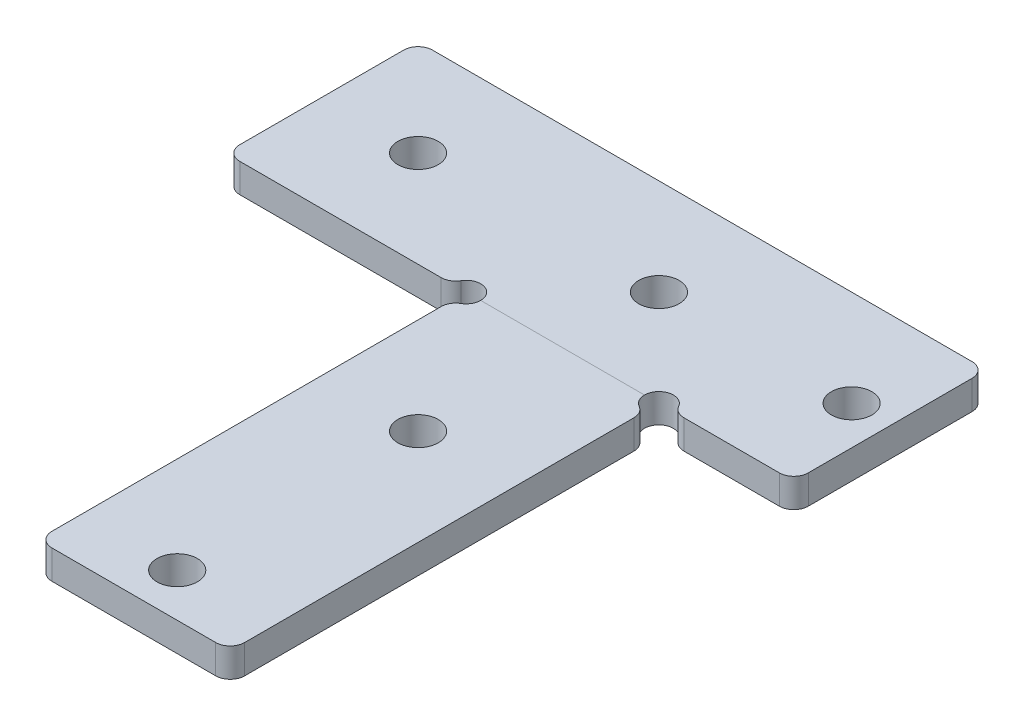
ISO-10303-21;
HEADER;
FILE_DESCRIPTION(('STEP AP214'),'2;1');
FILE_NAME('part.step','',(''),(''),'','','');
FILE_SCHEMA(('AUTOMOTIVE_DESIGN { 1 0 10303 214 1 1 1 1 }'));
ENDSEC;
DATA;
#1=APPLICATION_CONTEXT('core data for automotive mechanical design processes');
#2=APPLICATION_PROTOCOL_DEFINITION('international standard','automotive_design',2000,#1);
#3=PRODUCT_CONTEXT('',#1,'mechanical');
#4=PRODUCT('Part','Part','',(#3));
#5=PRODUCT_RELATED_PRODUCT_CATEGORY('part','',(#4));
#6=PRODUCT_DEFINITION_FORMATION('','',#4);
#7=PRODUCT_DEFINITION_CONTEXT('part definition',#1,'design');
#8=PRODUCT_DEFINITION('design','',#6,#7);
#9=PRODUCT_DEFINITION_SHAPE('','',#8);
#10=(LENGTH_UNIT() NAMED_UNIT(*) SI_UNIT(.MILLI.,.METRE.));
#11=(NAMED_UNIT(*) PLANE_ANGLE_UNIT() SI_UNIT($,.RADIAN.));
#12=(NAMED_UNIT(*) SI_UNIT($,.STERADIAN.) SOLID_ANGLE_UNIT());
#13=UNCERTAINTY_MEASURE_WITH_UNIT(LENGTH_MEASURE(1.E-05),#10,'distance_accuracy_value','');
#14=(GEOMETRIC_REPRESENTATION_CONTEXT(3) GLOBAL_UNCERTAINTY_ASSIGNED_CONTEXT((#13)) GLOBAL_UNIT_ASSIGNED_CONTEXT((#10,
#11,#12)) REPRESENTATION_CONTEXT('',''));
#15=CARTESIAN_POINT('',(0.,0.,0.));
#16=DIRECTION('',(0.,0.,1.));
#17=DIRECTION('',(1.,0.,0.));
#18=AXIS2_PLACEMENT_3D('',#15,#16,#17);
#19=CARTESIAN_POINT('',(0.,3.,0.));
#20=DIRECTION('',(0.,-1.,0.));
#21=DIRECTION('',(0.,0.,-1.));
#22=AXIS2_PLACEMENT_3D('',#19,#20,#21);
#23=PLANE('',#22);
#24=CARTESIAN_POINT('',(-25.,3.,0.));
#25=DIRECTION('',(0.,1.,0.));
#26=DIRECTION('',(0.,0.,1.));
#27=AXIS2_PLACEMENT_3D('',#24,#25,#26);
#28=CIRCLE('',#27,2.1);
#29=CARTESIAN_POINT('',(-25.,3.,2.1));
#30=VERTEX_POINT('',#29);
#31=EDGE_CURVE('E231',#30,#30,#28,.T.);
#32=ORIENTED_EDGE('',*,*,#31,.F.);
#33=EDGE_LOOP('',(#32));
#34=FACE_BOUND('',#33,.T.);
#35=CARTESIAN_POINT('',(20.,3.,0.));
#36=DIRECTION('',(0.,1.,0.));
#37=DIRECTION('',(0.,0.,1.));
#38=AXIS2_PLACEMENT_3D('',#35,#36,#37);
#39=CIRCLE('',#38,2.1);
#40=CARTESIAN_POINT('',(20.,3.,2.1));
#41=VERTEX_POINT('',#40);
#42=EDGE_CURVE('E237',#41,#41,#39,.T.);
#43=ORIENTED_EDGE('',*,*,#42,.F.);
#44=EDGE_LOOP('',(#43));
#45=FACE_BOUND('',#44,.T.);
#46=CARTESIAN_POINT('',(0.,3.,0.));
#47=DIRECTION('',(0.,1.,0.));
#48=DIRECTION('',(0.,0.,1.));
#49=AXIS2_PLACEMENT_3D('',#46,#47,#48);
#50=CIRCLE('',#49,2.1);
#51=CARTESIAN_POINT('',(0.,3.,2.1));
#52=VERTEX_POINT('',#51);
#53=EDGE_CURVE('E243',#52,#52,#50,.T.);
#54=ORIENTED_EDGE('',*,*,#53,.F.);
#55=EDGE_LOOP('',(#54));
#56=FACE_BOUND('',#55,.T.);
#57=DIRECTION('',(-1.,0.,0.));
#58=VECTOR('',#57,1.);
#59=CARTESIAN_POINT('',(0.,3.,10.));
#60=LINE('',#59,#58);
#61=CARTESIAN_POINT('',(8.5,3.,10.));
#62=VERTEX_POINT('',#61);
#63=CARTESIAN_POINT('',(-8.5,3.,10.));
#64=VERTEX_POINT('',#63);
#65=EDGE_CURVE('E11',#62,#64,#60,.T.);
#66=ORIENTED_EDGE('',*,*,#65,.F.);
#67=CARTESIAN_POINT('',(10.,3.,10.));
#68=DIRECTION('',(0.,1.,0.));
#69=DIRECTION('',(0.,0.,1.));
#70=AXIS2_PLACEMENT_3D('',#67,#68,#69);
#71=CIRCLE('',#70,1.5);
#72=CARTESIAN_POINT('',(11.2990381056767,3.,9.25));
#73=VERTEX_POINT('',#72);
#74=EDGE_CURVE('E215',#73,#62,#71,.T.);
#75=ORIENTED_EDGE('',*,*,#74,.F.);
#76=CARTESIAN_POINT('',(12.5980762113533,3.,8.5));
#77=DIRECTION('',(0.,-1.,0.));
#78=DIRECTION('',(0.,0.,-1.));
#79=AXIS2_PLACEMENT_3D('',#76,#77,#78);
#80=CIRCLE('',#79,1.5);
#81=CARTESIAN_POINT('',(12.5980762113533,3.,10.));
#82=VERTEX_POINT('',#81);
#83=EDGE_CURVE('E293',#73,#82,#80,.F.);
#84=ORIENTED_EDGE('',*,*,#83,.T.);
#85=DIRECTION('',(1.,0.,0.));
#86=VECTOR('',#85,1.);
#87=CARTESIAN_POINT('',(24.,3.,10.));
#88=LINE('',#87,#86);
#89=CARTESIAN_POINT('',(22.5,3.,10.));
#90=VERTEX_POINT('',#89);
#91=EDGE_CURVE('E257',#82,#90,#88,.T.);
#92=ORIENTED_EDGE('',*,*,#91,.T.);
#93=CARTESIAN_POINT('',(22.5,3.,8.5));
#94=DIRECTION('',(0.,-1.,0.));
#95=DIRECTION('',(0.,0.,-1.));
#96=AXIS2_PLACEMENT_3D('',#93,#94,#95);
#97=CIRCLE('',#96,1.5);
#98=CARTESIAN_POINT('',(24.,3.,8.5));
#99=VERTEX_POINT('',#98);
#100=EDGE_CURVE('E295',#90,#99,#97,.F.);
#101=ORIENTED_EDGE('',*,*,#100,.T.);
#102=DIRECTION('',(0.,0.,-1.));
#103=VECTOR('',#102,1.);
#104=CARTESIAN_POINT('',(24.,3.,-10.));
#105=LINE('',#104,#103);
#106=CARTESIAN_POINT('',(24.,3.,-8.5));
#107=VERTEX_POINT('',#106);
#108=EDGE_CURVE('E260',#99,#107,#105,.T.);
#109=ORIENTED_EDGE('',*,*,#108,.T.);
#110=CARTESIAN_POINT('',(22.5,3.,-8.5));
#111=DIRECTION('',(0.,-1.,0.));
#112=DIRECTION('',(0.,0.,-1.));
#113=AXIS2_PLACEMENT_3D('',#110,#111,#112);
#114=CIRCLE('',#113,1.5);
#115=CARTESIAN_POINT('',(22.5,3.,-10.));
#116=VERTEX_POINT('',#115);
#117=EDGE_CURVE('E204',#107,#116,#114,.F.);
#118=ORIENTED_EDGE('',*,*,#117,.T.);
#119=DIRECTION('',(-1.,0.,0.));
#120=VECTOR('',#119,1.);
#121=CARTESIAN_POINT('',(-35.,3.,-10.));
#122=LINE('',#121,#120);
#123=CARTESIAN_POINT('',(-33.5,3.,-10.));
#124=VERTEX_POINT('',#123);
#125=EDGE_CURVE('E263',#116,#124,#122,.T.);
#126=ORIENTED_EDGE('',*,*,#125,.T.);
#127=CARTESIAN_POINT('',(-33.5,3.,-8.5));
#128=DIRECTION('',(0.,-1.,0.));
#129=DIRECTION('',(0.,0.,-1.));
#130=AXIS2_PLACEMENT_3D('',#127,#128,#129);
#131=CIRCLE('',#130,1.5);
#132=CARTESIAN_POINT('',(-35.,3.,-8.5));
#133=VERTEX_POINT('',#132);
#134=EDGE_CURVE('E297',#124,#133,#131,.F.);
#135=ORIENTED_EDGE('',*,*,#134,.T.);
#136=DIRECTION('',(0.,0.,1.));
#137=VECTOR('',#136,1.);
#138=CARTESIAN_POINT('',(-35.,3.,10.));
#139=LINE('',#138,#137);
#140=CARTESIAN_POINT('',(-35.,3.,8.5));
#141=VERTEX_POINT('',#140);
#142=EDGE_CURVE('E266',#133,#141,#139,.T.);
#143=ORIENTED_EDGE('',*,*,#142,.T.);
#144=CARTESIAN_POINT('',(-33.5,3.,8.5));
#145=DIRECTION('',(0.,-1.,0.));
#146=DIRECTION('',(0.,0.,-1.));
#147=AXIS2_PLACEMENT_3D('',#144,#145,#146);
#148=CIRCLE('',#147,1.5);
#149=CARTESIAN_POINT('',(-33.5,3.,10.));
#150=VERTEX_POINT('',#149);
#151=EDGE_CURVE('E299',#141,#150,#148,.F.);
#152=ORIENTED_EDGE('',*,*,#151,.T.);
#153=DIRECTION('',(1.,0.,0.));
#154=VECTOR('',#153,1.);
#155=CARTESIAN_POINT('',(-10.,3.,10.));
#156=LINE('',#155,#154);
#157=CARTESIAN_POINT('',(-12.5980762113533,3.,10.));
#158=VERTEX_POINT('',#157);
#159=EDGE_CURVE('E249',#150,#158,#156,.T.);
#160=ORIENTED_EDGE('',*,*,#159,.T.);
#161=CARTESIAN_POINT('',(-12.5980762113533,3.,8.5));
#162=DIRECTION('',(0.,-1.,0.));
#163=DIRECTION('',(0.,0.,-1.));
#164=AXIS2_PLACEMENT_3D('',#161,#162,#163);
#165=CIRCLE('',#164,1.5);
#166=CARTESIAN_POINT('',(-11.2990381056767,3.,9.25));
#167=VERTEX_POINT('',#166);
#168=EDGE_CURVE('E301',#158,#167,#165,.F.);
#169=ORIENTED_EDGE('',*,*,#168,.T.);
#170=CARTESIAN_POINT('',(-10.,3.,10.));
#171=DIRECTION('',(0.,1.,0.));
#172=DIRECTION('',(0.,0.,1.));
#173=AXIS2_PLACEMENT_3D('',#170,#171,#172);
#174=CIRCLE('',#173,1.5);
#175=EDGE_CURVE('E429',#64,#167,#174,.T.);
#176=ORIENTED_EDGE('',*,*,#175,.F.);
#177=EDGE_LOOP('',(#66,#75,#84,#92,#101,#109,#118,#126,#135,#143,#152,#160,#169,#176));
#178=FACE_BOUND('',#177,.T.);
#179=ADVANCED_FACE('F43',(#34,#45,#56,#178),#23,.F.);
#180=CARTESIAN_POINT('',(9.25,3.,11.2990381056767));
#181=VERTEX_POINT('',#180);
#182=EDGE_CURVE('E375',#62,#181,#71,.T.);
#183=ORIENTED_EDGE('',*,*,#182,.F.);
#184=ORIENTED_EDGE('',*,*,#65,.T.);
#185=CARTESIAN_POINT('',(-9.25,3.,11.2990381056767));
#186=VERTEX_POINT('',#185);
#187=EDGE_CURVE('E432',#186,#64,#174,.T.);
#188=ORIENTED_EDGE('',*,*,#187,.F.);
#189=CARTESIAN_POINT('',(-8.5,3.,12.5980762113533));
#190=DIRECTION('',(0.,-1.,0.));
#191=DIRECTION('',(0.,0.,-1.));
#192=AXIS2_PLACEMENT_3D('',#189,#190,#191);
#193=CIRCLE('',#192,1.5);
#194=CARTESIAN_POINT('',(-10.,3.,12.5980762113533));
#195=VERTEX_POINT('',#194);
#196=EDGE_CURVE('E304',#186,#195,#193,.F.);
#197=ORIENTED_EDGE('',*,*,#196,.T.);
#198=DIRECTION('',(0.,0.,1.));
#199=VECTOR('',#198,1.);
#200=CARTESIAN_POINT('',(-9.99999999999999,3.,60.));
#201=LINE('',#200,#199);
#202=CARTESIAN_POINT('',(-9.99999999999999,3.,53.));
#203=VERTEX_POINT('',#202);
#204=EDGE_CURVE('E252',#195,#203,#201,.T.);
#205=ORIENTED_EDGE('',*,*,#204,.T.);
#206=CARTESIAN_POINT('',(-8.49999999999999,3.,53.));
#207=DIRECTION('',(0.,-1.,0.));
#208=DIRECTION('',(0.,0.,-1.));
#209=AXIS2_PLACEMENT_3D('',#206,#207,#208);
#210=CIRCLE('',#209,1.5);
#211=CARTESIAN_POINT('',(-8.49999999999999,3.,54.5));
#212=VERTEX_POINT('',#211);
#213=EDGE_CURVE('E194',#203,#212,#210,.F.);
#214=ORIENTED_EDGE('',*,*,#213,.T.);
#215=DIRECTION('',(-1.,0.,0.));
#216=VECTOR('',#215,1.);
#217=CARTESIAN_POINT('',(-9.99999999999999,3.,54.5));
#218=LINE('',#217,#216);
#219=CARTESIAN_POINT('',(8.50000000000001,3.,54.5));
#220=VERTEX_POINT('',#219);
#221=EDGE_CURVE('E200',#220,#212,#218,.T.);
#222=ORIENTED_EDGE('',*,*,#221,.F.);
#223=CARTESIAN_POINT('',(8.50000000000001,3.,53.));
#224=DIRECTION('',(0.,-1.,0.));
#225=DIRECTION('',(0.,0.,-1.));
#226=AXIS2_PLACEMENT_3D('',#223,#224,#225);
#227=CIRCLE('',#226,1.5);
#228=CARTESIAN_POINT('',(10.,3.,53.));
#229=VERTEX_POINT('',#228);
#230=EDGE_CURVE('E184',#220,#229,#227,.F.);
#231=ORIENTED_EDGE('',*,*,#230,.T.);
#232=DIRECTION('',(0.,0.,-1.));
#233=VECTOR('',#232,1.);
#234=CARTESIAN_POINT('',(10.,3.,10.));
#235=LINE('',#234,#233);
#236=CARTESIAN_POINT('',(10.,3.,12.5980762113533));
#237=VERTEX_POINT('',#236);
#238=EDGE_CURVE('E255',#229,#237,#235,.T.);
#239=ORIENTED_EDGE('',*,*,#238,.T.);
#240=CARTESIAN_POINT('',(8.5,3.,12.5980762113533));
#241=DIRECTION('',(0.,-1.,0.));
#242=DIRECTION('',(0.,0.,-1.));
#243=AXIS2_PLACEMENT_3D('',#240,#241,#242);
#244=CIRCLE('',#243,1.5);
#245=EDGE_CURVE('E290',#237,#181,#244,.F.);
#246=ORIENTED_EDGE('',*,*,#245,.T.);
#247=EDGE_LOOP('',(#183,#184,#188,#197,#205,#214,#222,#231,#239,#246));
#248=FACE_BOUND('',#247,.T.);
#249=CARTESIAN_POINT('',(0.,3.,25.));
#250=DIRECTION('',(0.,1.,0.));
#251=DIRECTION('',(0.,0.,1.));
#252=AXIS2_PLACEMENT_3D('',#249,#250,#251);
#253=CIRCLE('',#252,2.1);
#254=CARTESIAN_POINT('',(0.,3.,27.1));
#255=VERTEX_POINT('',#254);
#256=EDGE_CURVE('E225',#255,#255,#253,.T.);
#257=ORIENTED_EDGE('',*,*,#256,.F.);
#258=EDGE_LOOP('',(#257));
#259=FACE_BOUND('',#258,.T.);
#260=CARTESIAN_POINT('',(0.,3.,50.));
#261=DIRECTION('',(0.,1.,0.));
#262=DIRECTION('',(0.,0.,1.));
#263=AXIS2_PLACEMENT_3D('',#260,#261,#262);
#264=CIRCLE('',#263,2.1);
#265=CARTESIAN_POINT('',(0.,3.,52.1));
#266=VERTEX_POINT('',#265);
#267=EDGE_CURVE('E219',#266,#266,#264,.T.);
#268=ORIENTED_EDGE('',*,*,#267,.F.);
#269=EDGE_LOOP('',(#268));
#270=FACE_BOUND('',#269,.T.);
#271=ADVANCED_FACE('F207',(#248,#259,#270),#23,.F.);
#272=CARTESIAN_POINT('',(0.,0.,0.));
#273=DIRECTION('',(0.,-1.,0.));
#274=DIRECTION('',(0.,0.,-1.));
#275=AXIS2_PLACEMENT_3D('',#272,#273,#274);
#276=PLANE('',#275);
#277=DIRECTION('',(0.,0.,-1.));
#278=VECTOR('',#277,1.);
#279=CARTESIAN_POINT('',(10.,0.,10.));
#280=LINE('',#279,#278);
#281=CARTESIAN_POINT('',(10.,0.,53.));
#282=VERTEX_POINT('',#281);
#283=CARTESIAN_POINT('',(10.,0.,12.5980762113533));
#284=VERTEX_POINT('',#283);
#285=EDGE_CURVE('E274',#282,#284,#280,.T.);
#286=ORIENTED_EDGE('',*,*,#285,.F.);
#287=CARTESIAN_POINT('',(8.50000000000001,0.,53.));
#288=DIRECTION('',(0.,-1.,0.));
#289=DIRECTION('',(0.,0.,-1.));
#290=AXIS2_PLACEMENT_3D('',#287,#288,#289);
#291=CIRCLE('',#290,1.5);
#292=CARTESIAN_POINT('',(8.50000000000001,0.,54.5));
#293=VERTEX_POINT('',#292);
#294=EDGE_CURVE('E328',#282,#293,#291,.T.);
#295=ORIENTED_EDGE('',*,*,#294,.T.);
#296=DIRECTION('',(-1.,0.,0.));
#297=VECTOR('',#296,1.);
#298=CARTESIAN_POINT('',(-9.99999999999999,0.,54.5));
#299=LINE('',#298,#297);
#300=CARTESIAN_POINT('',(-8.49999999999999,0.,54.5));
#301=VERTEX_POINT('',#300);
#302=EDGE_CURVE('E203',#293,#301,#299,.T.);
#303=ORIENTED_EDGE('',*,*,#302,.T.);
#304=CARTESIAN_POINT('',(-8.49999999999999,0.,53.));
#305=DIRECTION('',(0.,-1.,0.));
#306=DIRECTION('',(0.,0.,-1.));
#307=AXIS2_PLACEMENT_3D('',#304,#305,#306);
#308=CIRCLE('',#307,1.5);
#309=CARTESIAN_POINT('',(-9.99999999999999,0.,53.));
#310=VERTEX_POINT('',#309);
#311=EDGE_CURVE('E326',#301,#310,#308,.T.);
#312=ORIENTED_EDGE('',*,*,#311,.T.);
#313=DIRECTION('',(0.,0.,1.));
#314=VECTOR('',#313,1.);
#315=CARTESIAN_POINT('',(-9.99999999999999,0.,60.));
#316=LINE('',#315,#314);
#317=CARTESIAN_POINT('',(-10.,0.,12.5980762113533));
#318=VERTEX_POINT('',#317);
#319=EDGE_CURVE('E271',#318,#310,#316,.T.);
#320=ORIENTED_EDGE('',*,*,#319,.F.);
#321=CARTESIAN_POINT('',(-8.5,0.,12.5980762113533));
#322=DIRECTION('',(0.,-1.,0.));
#323=DIRECTION('',(0.,0.,-1.));
#324=AXIS2_PLACEMENT_3D('',#321,#322,#323);
#325=CIRCLE('',#324,1.5);
#326=CARTESIAN_POINT('',(-9.25,0.,11.2990381056767));
#327=VERTEX_POINT('',#326);
#328=EDGE_CURVE('E324',#318,#327,#325,.T.);
#329=ORIENTED_EDGE('',*,*,#328,.T.);
#330=CARTESIAN_POINT('',(-10.,0.,10.));
#331=DIRECTION('',(0.,1.,0.));
#332=DIRECTION('',(0.,0.,1.));
#333=AXIS2_PLACEMENT_3D('',#330,#331,#332);
#334=CIRCLE('',#333,1.5);
#335=CARTESIAN_POINT('',(-11.2990381056767,0.,9.25));
#336=VERTEX_POINT('',#335);
#337=EDGE_CURVE('E425',#327,#336,#334,.T.);
#338=ORIENTED_EDGE('',*,*,#337,.T.);
#339=CARTESIAN_POINT('',(-12.5980762113533,0.,8.5));
#340=DIRECTION('',(0.,-1.,0.));
#341=DIRECTION('',(0.,0.,-1.));
#342=AXIS2_PLACEMENT_3D('',#339,#340,#341);
#343=CIRCLE('',#342,1.5);
#344=CARTESIAN_POINT('',(-12.5980762113533,0.,10.));
#345=VERTEX_POINT('',#344);
#346=EDGE_CURVE('E322',#336,#345,#343,.T.);
#347=ORIENTED_EDGE('',*,*,#346,.T.);
#348=DIRECTION('',(1.,0.,0.));
#349=VECTOR('',#348,1.);
#350=CARTESIAN_POINT('',(-10.,0.,10.));
#351=LINE('',#350,#349);
#352=CARTESIAN_POINT('',(-33.5,0.,10.));
#353=VERTEX_POINT('',#352);
#354=EDGE_CURVE('E246',#353,#345,#351,.T.);
#355=ORIENTED_EDGE('',*,*,#354,.F.);
#356=CARTESIAN_POINT('',(-33.5,0.,8.5));
#357=DIRECTION('',(0.,-1.,0.));
#358=DIRECTION('',(0.,0.,-1.));
#359=AXIS2_PLACEMENT_3D('',#356,#357,#358);
#360=CIRCLE('',#359,1.5);
#361=CARTESIAN_POINT('',(-35.,0.,8.5));
#362=VERTEX_POINT('',#361);
#363=EDGE_CURVE('E320',#353,#362,#360,.T.);
#364=ORIENTED_EDGE('',*,*,#363,.T.);
#365=DIRECTION('',(0.,0.,1.));
#366=VECTOR('',#365,1.);
#367=CARTESIAN_POINT('',(-35.,0.,10.));
#368=LINE('',#367,#366);
#369=CARTESIAN_POINT('',(-35.,0.,-8.5));
#370=VERTEX_POINT('',#369);
#371=EDGE_CURVE('E253',#370,#362,#368,.T.);
#372=ORIENTED_EDGE('',*,*,#371,.F.);
#373=CARTESIAN_POINT('',(-33.5,0.,-8.5));
#374=DIRECTION('',(0.,-1.,0.));
#375=DIRECTION('',(0.,0.,-1.));
#376=AXIS2_PLACEMENT_3D('',#373,#374,#375);
#377=CIRCLE('',#376,1.5);
#378=CARTESIAN_POINT('',(-33.5,0.,-10.));
#379=VERTEX_POINT('',#378);
#380=EDGE_CURVE('E318',#370,#379,#377,.T.);
#381=ORIENTED_EDGE('',*,*,#380,.T.);
#382=DIRECTION('',(-1.,0.,0.));
#383=VECTOR('',#382,1.);
#384=CARTESIAN_POINT('',(-35.,0.,-10.));
#385=LINE('',#384,#383);
#386=CARTESIAN_POINT('',(22.5,0.,-10.));
#387=VERTEX_POINT('',#386);
#388=EDGE_CURVE('E283',#387,#379,#385,.T.);
#389=ORIENTED_EDGE('',*,*,#388,.F.);
#390=CARTESIAN_POINT('',(22.5,0.,-8.5));
#391=DIRECTION('',(0.,-1.,0.));
#392=DIRECTION('',(0.,0.,-1.));
#393=AXIS2_PLACEMENT_3D('',#390,#391,#392);
#394=CIRCLE('',#393,1.5);
#395=CARTESIAN_POINT('',(24.,0.,-8.5));
#396=VERTEX_POINT('',#395);
#397=EDGE_CURVE('E310',#387,#396,#394,.T.);
#398=ORIENTED_EDGE('',*,*,#397,.T.);
#399=DIRECTION('',(0.,0.,-1.));
#400=VECTOR('',#399,1.);
#401=CARTESIAN_POINT('',(24.,0.,-10.));
#402=LINE('',#401,#400);
#403=CARTESIAN_POINT('',(24.,0.,8.5));
#404=VERTEX_POINT('',#403);
#405=EDGE_CURVE('E280',#404,#396,#402,.T.);
#406=ORIENTED_EDGE('',*,*,#405,.F.);
#407=CARTESIAN_POINT('',(22.5,0.,8.5));
#408=DIRECTION('',(0.,-1.,0.));
#409=DIRECTION('',(0.,0.,-1.));
#410=AXIS2_PLACEMENT_3D('',#407,#408,#409);
#411=CIRCLE('',#410,1.5);
#412=CARTESIAN_POINT('',(22.5,0.,10.));
#413=VERTEX_POINT('',#412);
#414=EDGE_CURVE('E316',#404,#413,#411,.T.);
#415=ORIENTED_EDGE('',*,*,#414,.T.);
#416=DIRECTION('',(1.,0.,0.));
#417=VECTOR('',#416,1.);
#418=CARTESIAN_POINT('',(24.,0.,10.));
#419=LINE('',#418,#417);
#420=CARTESIAN_POINT('',(12.5980762113533,0.,10.));
#421=VERTEX_POINT('',#420);
#422=EDGE_CURVE('E277',#421,#413,#419,.T.);
#423=ORIENTED_EDGE('',*,*,#422,.F.);
#424=CARTESIAN_POINT('',(12.5980762113533,0.,8.5));
#425=DIRECTION('',(0.,-1.,0.));
#426=DIRECTION('',(0.,0.,-1.));
#427=AXIS2_PLACEMENT_3D('',#424,#425,#426);
#428=CIRCLE('',#427,1.5);
#429=CARTESIAN_POINT('',(11.2990381056767,0.,9.25));
#430=VERTEX_POINT('',#429);
#431=EDGE_CURVE('E314',#421,#430,#428,.T.);
#432=ORIENTED_EDGE('',*,*,#431,.T.);
#433=CARTESIAN_POINT('',(10.,0.,10.));
#434=DIRECTION('',(0.,1.,0.));
#435=DIRECTION('',(0.,0.,1.));
#436=AXIS2_PLACEMENT_3D('',#433,#434,#435);
#437=CIRCLE('',#436,1.5);
#438=CARTESIAN_POINT('',(9.25,0.,11.2990381056767));
#439=VERTEX_POINT('',#438);
#440=EDGE_CURVE('E210',#430,#439,#437,.T.);
#441=ORIENTED_EDGE('',*,*,#440,.T.);
#442=CARTESIAN_POINT('',(8.5,0.,12.5980762113533));
#443=DIRECTION('',(0.,-1.,0.));
#444=DIRECTION('',(0.,0.,-1.));
#445=AXIS2_PLACEMENT_3D('',#442,#443,#444);
#446=CIRCLE('',#445,1.5);
#447=EDGE_CURVE('E312',#439,#284,#446,.T.);
#448=ORIENTED_EDGE('',*,*,#447,.T.);
#449=EDGE_LOOP('',(#286,#295,#303,#312,#320,#329,#338,#347,#355,#364,#372,#381,#389,#398,#406,
#415,#423,#432,#441,#448));
#450=FACE_BOUND('',#449,.T.);
#451=CARTESIAN_POINT('',(0.,0.,25.));
#452=DIRECTION('',(0.,1.,0.));
#453=DIRECTION('',(0.,0.,1.));
#454=AXIS2_PLACEMENT_3D('',#451,#452,#453);
#455=CIRCLE('',#454,2.1);
#456=CARTESIAN_POINT('',(0.,0.,27.1));
#457=VERTEX_POINT('',#456);
#458=EDGE_CURVE('E222',#457,#457,#455,.T.);
#459=ORIENTED_EDGE('',*,*,#458,.T.);
#460=EDGE_LOOP('',(#459));
#461=FACE_BOUND('',#460,.T.);
#462=CARTESIAN_POINT('',(20.,0.,0.));
#463=DIRECTION('',(0.,1.,0.));
#464=DIRECTION('',(0.,0.,1.));
#465=AXIS2_PLACEMENT_3D('',#462,#463,#464);
#466=CIRCLE('',#465,2.1);
#467=CARTESIAN_POINT('',(20.,0.,2.1));
#468=VERTEX_POINT('',#467);
#469=EDGE_CURVE('E234',#468,#468,#466,.T.);
#470=ORIENTED_EDGE('',*,*,#469,.T.);
#471=EDGE_LOOP('',(#470));
#472=FACE_BOUND('',#471,.T.);
#473=CARTESIAN_POINT('',(0.,0.,0.));
#474=DIRECTION('',(0.,1.,0.));
#475=DIRECTION('',(0.,0.,1.));
#476=AXIS2_PLACEMENT_3D('',#473,#474,#475);
#477=CIRCLE('',#476,2.1);
#478=CARTESIAN_POINT('',(0.,0.,2.1));
#479=VERTEX_POINT('',#478);
#480=EDGE_CURVE('E240',#479,#479,#477,.T.);
#481=ORIENTED_EDGE('',*,*,#480,.T.);
#482=EDGE_LOOP('',(#481));
#483=FACE_BOUND('',#482,.T.);
#484=CARTESIAN_POINT('',(-25.,0.,0.));
#485=DIRECTION('',(0.,1.,0.));
#486=DIRECTION('',(0.,0.,1.));
#487=AXIS2_PLACEMENT_3D('',#484,#485,#486);
#488=CIRCLE('',#487,2.1);
#489=CARTESIAN_POINT('',(-25.,0.,2.1));
#490=VERTEX_POINT('',#489);
#491=EDGE_CURVE('E228',#490,#490,#488,.T.);
#492=ORIENTED_EDGE('',*,*,#491,.T.);
#493=EDGE_LOOP('',(#492));
#494=FACE_BOUND('',#493,.T.);
#495=CARTESIAN_POINT('',(0.,0.,50.));
#496=DIRECTION('',(0.,1.,0.));
#497=DIRECTION('',(0.,0.,1.));
#498=AXIS2_PLACEMENT_3D('',#495,#496,#497);
#499=CIRCLE('',#498,2.1);
#500=CARTESIAN_POINT('',(0.,0.,52.1));
#501=VERTEX_POINT('',#500);
#502=EDGE_CURVE('E212',#501,#501,#499,.T.);
#503=ORIENTED_EDGE('',*,*,#502,.T.);
#504=EDGE_LOOP('',(#503));
#505=FACE_BOUND('',#504,.T.);
#506=ADVANCED_FACE('F385',(#450,#461,#472,#483,#494,#505),#276,.T.);
#507=CARTESIAN_POINT('',(-10.,3.,10.));
#508=DIRECTION('',(0.,0.,-1.));
#509=DIRECTION('',(-1.,0.,0.));
#510=AXIS2_PLACEMENT_3D('',#507,#508,#509);
#511=PLANE('',#510);
#512=ORIENTED_EDGE('',*,*,#354,.T.);
#513=DIRECTION('',(0.,1.,0.));
#514=VECTOR('',#513,1.);
#515=CARTESIAN_POINT('',(-12.5980762113533,3.,10.));
#516=LINE('',#515,#514);
#517=EDGE_CURVE('E343',#345,#158,#516,.T.);
#518=ORIENTED_EDGE('',*,*,#517,.T.);
#519=ORIENTED_EDGE('',*,*,#159,.F.);
#520=DIRECTION('',(0.,-1.,0.));
#521=VECTOR('',#520,1.);
#522=CARTESIAN_POINT('',(-33.5,3.,10.));
#523=LINE('',#522,#521);
#524=EDGE_CURVE('E340',#150,#353,#523,.T.);
#525=ORIENTED_EDGE('',*,*,#524,.T.);
#526=EDGE_LOOP('',(#512,#518,#519,#525));
#527=FACE_BOUND('',#526,.T.);
#528=ADVANCED_FACE('F420',(#527),#511,.F.);
#529=CARTESIAN_POINT('',(-9.99999999999999,3.,60.));
#530=DIRECTION('',(1.,0.,0.));
#531=DIRECTION('',(0.,0.,-1.));
#532=AXIS2_PLACEMENT_3D('',#529,#530,#531);
#533=PLANE('',#532);
#534=ORIENTED_EDGE('',*,*,#319,.T.);
#535=DIRECTION('',(0.,1.,0.));
#536=VECTOR('',#535,1.);
#537=CARTESIAN_POINT('',(-9.99999999999999,3.,53.));
#538=LINE('',#537,#536);
#539=EDGE_CURVE('E333',#310,#203,#538,.T.);
#540=ORIENTED_EDGE('',*,*,#539,.T.);
#541=ORIENTED_EDGE('',*,*,#204,.F.);
#542=DIRECTION('',(0.,1.,0.));
#543=VECTOR('',#542,1.);
#544=CARTESIAN_POINT('',(-10.,3.,12.5980762113533));
#545=LINE('',#544,#543);
#546=EDGE_CURVE('E330',#195,#318,#545,.F.);
#547=ORIENTED_EDGE('',*,*,#546,.T.);
#548=EDGE_LOOP('',(#534,#540,#541,#547));
#549=FACE_BOUND('',#548,.T.);
#550=ADVANCED_FACE('F445',(#549),#533,.F.);
#551=CARTESIAN_POINT('',(10.,3.,10.));
#552=DIRECTION('',(-1.,0.,0.));
#553=DIRECTION('',(0.,0.,1.));
#554=AXIS2_PLACEMENT_3D('',#551,#552,#553);
#555=PLANE('',#554);
#556=ORIENTED_EDGE('',*,*,#238,.F.);
#557=DIRECTION('',(0.,1.,0.));
#558=VECTOR('',#557,1.);
#559=CARTESIAN_POINT('',(10.,3.,53.));
#560=LINE('',#559,#558);
#561=EDGE_CURVE('E189',#229,#282,#560,.F.);
#562=ORIENTED_EDGE('',*,*,#561,.T.);
#563=ORIENTED_EDGE('',*,*,#285,.T.);
#564=DIRECTION('',(0.,1.,0.));
#565=VECTOR('',#564,1.);
#566=CARTESIAN_POINT('',(10.,3.,12.5980762113533));
#567=LINE('',#566,#565);
#568=EDGE_CURVE('E193',#284,#237,#567,.T.);
#569=ORIENTED_EDGE('',*,*,#568,.T.);
#570=EDGE_LOOP('',(#556,#562,#563,#569));
#571=FACE_BOUND('',#570,.T.);
#572=ADVANCED_FACE('F443',(#571),#555,.F.);
#573=CARTESIAN_POINT('',(24.,3.,10.));
#574=DIRECTION('',(0.,0.,-1.));
#575=DIRECTION('',(-1.,0.,0.));
#576=AXIS2_PLACEMENT_3D('',#573,#574,#575);
#577=PLANE('',#576);
#578=ORIENTED_EDGE('',*,*,#422,.T.);
#579=DIRECTION('',(0.,-1.,0.));
#580=VECTOR('',#579,1.);
#581=CARTESIAN_POINT('',(22.5,3.,10.));
#582=LINE('',#581,#580);
#583=EDGE_CURVE('E364',#413,#90,#582,.F.);
#584=ORIENTED_EDGE('',*,*,#583,.T.);
#585=ORIENTED_EDGE('',*,*,#91,.F.);
#586=DIRECTION('',(0.,1.,0.));
#587=VECTOR('',#586,1.);
#588=CARTESIAN_POINT('',(12.5980762113533,3.,10.));
#589=LINE('',#588,#587);
#590=EDGE_CURVE('E361',#82,#421,#589,.F.);
#591=ORIENTED_EDGE('',*,*,#590,.T.);
#592=EDGE_LOOP('',(#578,#584,#585,#591));
#593=FACE_BOUND('',#592,.T.);
#594=ADVANCED_FACE('F381',(#593),#577,.F.);
#595=CARTESIAN_POINT('',(24.,3.,-10.));
#596=DIRECTION('',(-1.,0.,0.));
#597=DIRECTION('',(0.,0.,1.));
#598=AXIS2_PLACEMENT_3D('',#595,#596,#597);
#599=PLANE('',#598);
#600=ORIENTED_EDGE('',*,*,#108,.F.);
#601=DIRECTION('',(0.,-1.,0.));
#602=VECTOR('',#601,1.);
#603=CARTESIAN_POINT('',(24.,3.,8.5));
#604=LINE('',#603,#602);
#605=EDGE_CURVE('E358',#99,#404,#604,.T.);
#606=ORIENTED_EDGE('',*,*,#605,.T.);
#607=ORIENTED_EDGE('',*,*,#405,.T.);
#608=DIRECTION('',(0.,-1.,0.));
#609=VECTOR('',#608,1.);
#610=CARTESIAN_POINT('',(24.,3.,-8.5));
#611=LINE('',#610,#609);
#612=EDGE_CURVE('E356',#396,#107,#611,.F.);
#613=ORIENTED_EDGE('',*,*,#612,.T.);
#614=EDGE_LOOP('',(#600,#606,#607,#613));
#615=FACE_BOUND('',#614,.T.);
#616=ADVANCED_FACE('F394',(#615),#599,.F.);
#617=CARTESIAN_POINT('',(-35.,3.,-10.));
#618=DIRECTION('',(0.,0.,1.));
#619=DIRECTION('',(1.,0.,0.));
#620=AXIS2_PLACEMENT_3D('',#617,#618,#619);
#621=PLANE('',#620);
#622=ORIENTED_EDGE('',*,*,#388,.T.);
#623=DIRECTION('',(0.,-1.,0.));
#624=VECTOR('',#623,1.);
#625=CARTESIAN_POINT('',(-33.5,3.,-10.));
#626=LINE('',#625,#624);
#627=EDGE_CURVE('E354',#379,#124,#626,.F.);
#628=ORIENTED_EDGE('',*,*,#627,.T.);
#629=ORIENTED_EDGE('',*,*,#125,.F.);
#630=DIRECTION('',(0.,-1.,0.));
#631=VECTOR('',#630,1.);
#632=CARTESIAN_POINT('',(22.5,3.,-10.));
#633=LINE('',#632,#631);
#634=EDGE_CURVE('E351',#116,#387,#633,.T.);
#635=ORIENTED_EDGE('',*,*,#634,.T.);
#636=EDGE_LOOP('',(#622,#628,#629,#635));
#637=FACE_BOUND('',#636,.T.);
#638=ADVANCED_FACE('F402',(#637),#621,.F.);
#639=CARTESIAN_POINT('',(-35.,3.,10.));
#640=DIRECTION('',(1.,0.,0.));
#641=DIRECTION('',(0.,0.,-1.));
#642=AXIS2_PLACEMENT_3D('',#639,#640,#641);
#643=PLANE('',#642);
#644=ORIENTED_EDGE('',*,*,#371,.T.);
#645=DIRECTION('',(0.,-1.,0.));
#646=VECTOR('',#645,1.);
#647=CARTESIAN_POINT('',(-35.,3.,8.5));
#648=LINE('',#647,#646);
#649=EDGE_CURVE('E349',#362,#141,#648,.F.);
#650=ORIENTED_EDGE('',*,*,#649,.T.);
#651=ORIENTED_EDGE('',*,*,#142,.F.);
#652=DIRECTION('',(0.,-1.,0.));
#653=VECTOR('',#652,1.);
#654=CARTESIAN_POINT('',(-35.,3.,-8.5));
#655=LINE('',#654,#653);
#656=EDGE_CURVE('E346',#133,#370,#655,.T.);
#657=ORIENTED_EDGE('',*,*,#656,.T.);
#658=EDGE_LOOP('',(#644,#650,#651,#657));
#659=FACE_BOUND('',#658,.T.);
#660=ADVANCED_FACE('F411',(#659),#643,.F.);
#661=CARTESIAN_POINT('',(0.,3.,0.));
#662=DIRECTION('',(0.,-1.,0.));
#663=DIRECTION('',(0.,0.,-1.));
#664=AXIS2_PLACEMENT_3D('',#661,#662,#663);
#665=CYLINDRICAL_SURFACE('',#664,2.1);
#666=ORIENTED_EDGE('',*,*,#53,.T.);
#667=EDGE_LOOP('',(#666));
#668=FACE_BOUND('',#667,.T.);
#669=ORIENTED_EDGE('',*,*,#480,.F.);
#670=EDGE_LOOP('',(#669));
#671=FACE_BOUND('',#670,.T.);
#672=ADVANCED_FACE('F465',(#668,#671),#665,.F.);
#673=CARTESIAN_POINT('',(20.,3.,0.));
#674=DIRECTION('',(0.,-1.,0.));
#675=DIRECTION('',(0.,0.,-1.));
#676=AXIS2_PLACEMENT_3D('',#673,#674,#675);
#677=CYLINDRICAL_SURFACE('',#676,2.1);
#678=ORIENTED_EDGE('',*,*,#42,.T.);
#679=EDGE_LOOP('',(#678));
#680=FACE_BOUND('',#679,.T.);
#681=ORIENTED_EDGE('',*,*,#469,.F.);
#682=EDGE_LOOP('',(#681));
#683=FACE_BOUND('',#682,.T.);
#684=ADVANCED_FACE('F592',(#680,#683),#677,.F.);
#685=CARTESIAN_POINT('',(-25.,3.,0.));
#686=DIRECTION('',(0.,-1.,0.));
#687=DIRECTION('',(0.,0.,-1.));
#688=AXIS2_PLACEMENT_3D('',#685,#686,#687);
#689=CYLINDRICAL_SURFACE('',#688,2.1);
#690=ORIENTED_EDGE('',*,*,#31,.T.);
#691=EDGE_LOOP('',(#690));
#692=FACE_BOUND('',#691,.T.);
#693=ORIENTED_EDGE('',*,*,#491,.F.);
#694=EDGE_LOOP('',(#693));
#695=FACE_BOUND('',#694,.T.);
#696=ADVANCED_FACE('F589',(#692,#695),#689,.F.);
#697=CARTESIAN_POINT('',(0.,3.,25.));
#698=DIRECTION('',(0.,-1.,0.));
#699=DIRECTION('',(0.,0.,-1.));
#700=AXIS2_PLACEMENT_3D('',#697,#698,#699);
#701=CYLINDRICAL_SURFACE('',#700,2.1);
#702=ORIENTED_EDGE('',*,*,#256,.T.);
#703=EDGE_LOOP('',(#702));
#704=FACE_BOUND('',#703,.T.);
#705=ORIENTED_EDGE('',*,*,#458,.F.);
#706=EDGE_LOOP('',(#705));
#707=FACE_BOUND('',#706,.T.);
#708=ADVANCED_FACE('F585',(#704,#707),#701,.F.);
#709=CARTESIAN_POINT('',(0.,3.,50.));
#710=DIRECTION('',(0.,-1.,0.));
#711=DIRECTION('',(0.,0.,-1.));
#712=AXIS2_PLACEMENT_3D('',#709,#710,#711);
#713=CYLINDRICAL_SURFACE('',#712,2.1);
#714=ORIENTED_EDGE('',*,*,#267,.T.);
#715=EDGE_LOOP('',(#714));
#716=FACE_BOUND('',#715,.T.);
#717=ORIENTED_EDGE('',*,*,#502,.F.);
#718=EDGE_LOOP('',(#717));
#719=FACE_BOUND('',#718,.T.);
#720=ADVANCED_FACE('F493',(#716,#719),#713,.F.);
#721=CARTESIAN_POINT('',(-9.99999999999999,0.,54.5));
#722=DIRECTION('',(0.,0.,-1.));
#723=DIRECTION('',(-1.,0.,0.));
#724=AXIS2_PLACEMENT_3D('',#721,#722,#723);
#725=PLANE('',#724);
#726=ORIENTED_EDGE('',*,*,#302,.F.);
#727=DIRECTION('',(0.,1.,0.));
#728=VECTOR('',#727,1.);
#729=CARTESIAN_POINT('',(8.50000000000001,0.,54.5));
#730=LINE('',#729,#728);
#731=EDGE_CURVE('E188',#293,#220,#730,.T.);
#732=ORIENTED_EDGE('',*,*,#731,.T.);
#733=ORIENTED_EDGE('',*,*,#221,.T.);
#734=DIRECTION('',(0.,1.,0.));
#735=VECTOR('',#734,1.);
#736=CARTESIAN_POINT('',(-8.49999999999999,0.,54.5));
#737=LINE('',#736,#735);
#738=EDGE_CURVE('E205',#212,#301,#737,.F.);
#739=ORIENTED_EDGE('',*,*,#738,.T.);
#740=EDGE_LOOP('',(#726,#732,#733,#739));
#741=FACE_BOUND('',#740,.T.);
#742=ADVANCED_FACE('F199',(#741),#725,.F.);
#743=CARTESIAN_POINT('',(10.,0.,10.));
#744=DIRECTION('',(0.,1.,0.));
#745=DIRECTION('',(0.,0.,1.));
#746=AXIS2_PLACEMENT_3D('',#743,#744,#745);
#747=CYLINDRICAL_SURFACE('',#746,1.5);
#748=ORIENTED_EDGE('',*,*,#440,.F.);
#749=DIRECTION('',(0.,1.,0.));
#750=VECTOR('',#749,1.);
#751=CARTESIAN_POINT('',(11.2990381056767,0.,9.25));
#752=LINE('',#751,#750);
#753=EDGE_CURVE('E52',#430,#73,#752,.T.);
#754=ORIENTED_EDGE('',*,*,#753,.T.);
#755=ORIENTED_EDGE('',*,*,#74,.T.);
#756=ORIENTED_EDGE('',*,*,#182,.T.);
#757=DIRECTION('',(0.,1.,0.));
#758=VECTOR('',#757,1.);
#759=CARTESIAN_POINT('',(9.25,0.,11.2990381056767));
#760=LINE('',#759,#758);
#761=EDGE_CURVE('E366',#181,#439,#760,.F.);
#762=ORIENTED_EDGE('',*,*,#761,.T.);
#763=EDGE_LOOP('',(#748,#754,#755,#756,#762));
#764=FACE_BOUND('',#763,.T.);
#765=ADVANCED_FACE('F371',(#764),#747,.F.);
#766=CARTESIAN_POINT('',(-10.,0.,10.));
#767=DIRECTION('',(0.,1.,0.));
#768=DIRECTION('',(0.,0.,1.));
#769=AXIS2_PLACEMENT_3D('',#766,#767,#768);
#770=CYLINDRICAL_SURFACE('',#769,1.5);
#771=ORIENTED_EDGE('',*,*,#337,.F.);
#772=DIRECTION('',(0.,1.,0.));
#773=VECTOR('',#772,1.);
#774=CARTESIAN_POINT('',(-9.25,0.,11.2990381056767));
#775=LINE('',#774,#773);
#776=EDGE_CURVE('E338',#327,#186,#775,.T.);
#777=ORIENTED_EDGE('',*,*,#776,.T.);
#778=ORIENTED_EDGE('',*,*,#187,.T.);
#779=ORIENTED_EDGE('',*,*,#175,.T.);
#780=DIRECTION('',(0.,1.,0.));
#781=VECTOR('',#780,1.);
#782=CARTESIAN_POINT('',(-11.2990381056767,0.,9.25));
#783=LINE('',#782,#781);
#784=EDGE_CURVE('E336',#167,#336,#783,.F.);
#785=ORIENTED_EDGE('',*,*,#784,.T.);
#786=EDGE_LOOP('',(#771,#777,#778,#779,#785));
#787=FACE_BOUND('',#786,.T.);
#788=ADVANCED_FACE('F433',(#787),#770,.F.);
#789=CARTESIAN_POINT('',(8.50000000000001,0.,53.));
#790=DIRECTION('',(0.,1.,0.));
#791=DIRECTION('',(0.,0.,1.));
#792=AXIS2_PLACEMENT_3D('',#789,#790,#791);
#793=CYLINDRICAL_SURFACE('',#792,1.5);
#794=ORIENTED_EDGE('',*,*,#294,.F.);
#795=ORIENTED_EDGE('',*,*,#561,.F.);
#796=ORIENTED_EDGE('',*,*,#230,.F.);
#797=ORIENTED_EDGE('',*,*,#731,.F.);
#798=EDGE_LOOP('',(#794,#795,#796,#797));
#799=FACE_BOUND('',#798,.T.);
#800=ADVANCED_FACE('F187',(#799),#793,.T.);
#801=CARTESIAN_POINT('',(-8.49999999999999,3.,53.));
#802=DIRECTION('',(0.,1.,0.));
#803=DIRECTION('',(0.,0.,1.));
#804=AXIS2_PLACEMENT_3D('',#801,#802,#803);
#805=CYLINDRICAL_SURFACE('',#804,1.5);
#806=ORIENTED_EDGE('',*,*,#311,.F.);
#807=ORIENTED_EDGE('',*,*,#738,.F.);
#808=ORIENTED_EDGE('',*,*,#213,.F.);
#809=ORIENTED_EDGE('',*,*,#539,.F.);
#810=EDGE_LOOP('',(#806,#807,#808,#809));
#811=FACE_BOUND('',#810,.T.);
#812=ADVANCED_FACE('F502',(#811),#805,.T.);
#813=CARTESIAN_POINT('',(-8.5,0.,12.5980762113533));
#814=DIRECTION('',(0.,1.,0.));
#815=DIRECTION('',(0.,0.,1.));
#816=AXIS2_PLACEMENT_3D('',#813,#814,#815);
#817=CYLINDRICAL_SURFACE('',#816,1.5);
#818=ORIENTED_EDGE('',*,*,#196,.F.);
#819=ORIENTED_EDGE('',*,*,#776,.F.);
#820=ORIENTED_EDGE('',*,*,#328,.F.);
#821=ORIENTED_EDGE('',*,*,#546,.F.);
#822=EDGE_LOOP('',(#818,#819,#820,#821));
#823=FACE_BOUND('',#822,.T.);
#824=ADVANCED_FACE('F510',(#823),#817,.T.);
#825=CARTESIAN_POINT('',(-12.5980762113533,0.,8.5));
#826=DIRECTION('',(0.,1.,0.));
#827=DIRECTION('',(0.,0.,1.));
#828=AXIS2_PLACEMENT_3D('',#825,#826,#827);
#829=CYLINDRICAL_SURFACE('',#828,1.5);
#830=ORIENTED_EDGE('',*,*,#346,.F.);
#831=ORIENTED_EDGE('',*,*,#784,.F.);
#832=ORIENTED_EDGE('',*,*,#168,.F.);
#833=ORIENTED_EDGE('',*,*,#517,.F.);
#834=EDGE_LOOP('',(#830,#831,#832,#833));
#835=FACE_BOUND('',#834,.T.);
#836=ADVANCED_FACE('F428',(#835),#829,.T.);
#837=CARTESIAN_POINT('',(-33.5,3.,8.5));
#838=DIRECTION('',(0.,-1.,0.));
#839=DIRECTION('',(0.,0.,-1.));
#840=AXIS2_PLACEMENT_3D('',#837,#838,#839);
#841=CYLINDRICAL_SURFACE('',#840,1.5);
#842=ORIENTED_EDGE('',*,*,#151,.F.);
#843=ORIENTED_EDGE('',*,*,#649,.F.);
#844=ORIENTED_EDGE('',*,*,#363,.F.);
#845=ORIENTED_EDGE('',*,*,#524,.F.);
#846=EDGE_LOOP('',(#842,#843,#844,#845));
#847=FACE_BOUND('',#846,.T.);
#848=ADVANCED_FACE('F417',(#847),#841,.T.);
#849=CARTESIAN_POINT('',(-33.5,3.,-8.5));
#850=DIRECTION('',(0.,-1.,0.));
#851=DIRECTION('',(0.,0.,-1.));
#852=AXIS2_PLACEMENT_3D('',#849,#850,#851);
#853=CYLINDRICAL_SURFACE('',#852,1.5);
#854=ORIENTED_EDGE('',*,*,#134,.F.);
#855=ORIENTED_EDGE('',*,*,#627,.F.);
#856=ORIENTED_EDGE('',*,*,#380,.F.);
#857=ORIENTED_EDGE('',*,*,#656,.F.);
#858=EDGE_LOOP('',(#854,#855,#856,#857));
#859=FACE_BOUND('',#858,.T.);
#860=ADVANCED_FACE('F408',(#859),#853,.T.);
#861=CARTESIAN_POINT('',(22.5,3.,8.5));
#862=DIRECTION('',(0.,-1.,0.));
#863=DIRECTION('',(0.,0.,-1.));
#864=AXIS2_PLACEMENT_3D('',#861,#862,#863);
#865=CYLINDRICAL_SURFACE('',#864,1.5);
#866=ORIENTED_EDGE('',*,*,#100,.F.);
#867=ORIENTED_EDGE('',*,*,#583,.F.);
#868=ORIENTED_EDGE('',*,*,#414,.F.);
#869=ORIENTED_EDGE('',*,*,#605,.F.);
#870=EDGE_LOOP('',(#866,#867,#868,#869));
#871=FACE_BOUND('',#870,.T.);
#872=ADVANCED_FACE('F391',(#871),#865,.T.);
#873=CARTESIAN_POINT('',(12.5980762113533,0.,8.5));
#874=DIRECTION('',(0.,1.,0.));
#875=DIRECTION('',(0.,0.,1.));
#876=AXIS2_PLACEMENT_3D('',#873,#874,#875);
#877=CYLINDRICAL_SURFACE('',#876,1.5);
#878=ORIENTED_EDGE('',*,*,#83,.F.);
#879=ORIENTED_EDGE('',*,*,#753,.F.);
#880=ORIENTED_EDGE('',*,*,#431,.F.);
#881=ORIENTED_EDGE('',*,*,#590,.F.);
#882=EDGE_LOOP('',(#878,#879,#880,#881));
#883=FACE_BOUND('',#882,.T.);
#884=ADVANCED_FACE('F378',(#883),#877,.T.);
#885=CARTESIAN_POINT('',(8.5,0.,12.5980762113533));
#886=DIRECTION('',(0.,1.,0.));
#887=DIRECTION('',(0.,0.,1.));
#888=AXIS2_PLACEMENT_3D('',#885,#886,#887);
#889=CYLINDRICAL_SURFACE('',#888,1.5);
#890=ORIENTED_EDGE('',*,*,#447,.F.);
#891=ORIENTED_EDGE('',*,*,#761,.F.);
#892=ORIENTED_EDGE('',*,*,#245,.F.);
#893=ORIENTED_EDGE('',*,*,#568,.F.);
#894=EDGE_LOOP('',(#890,#891,#892,#893));
#895=FACE_BOUND('',#894,.T.);
#896=ADVANCED_FACE('F441',(#895),#889,.T.);
#897=CARTESIAN_POINT('',(22.5,3.,-8.5));
#898=DIRECTION('',(0.,-1.,0.));
#899=DIRECTION('',(0.,0.,-1.));
#900=AXIS2_PLACEMENT_3D('',#897,#898,#899);
#901=CYLINDRICAL_SURFACE('',#900,1.5);
#902=ORIENTED_EDGE('',*,*,#117,.F.);
#903=ORIENTED_EDGE('',*,*,#612,.F.);
#904=ORIENTED_EDGE('',*,*,#397,.F.);
#905=ORIENTED_EDGE('',*,*,#634,.F.);
#906=EDGE_LOOP('',(#902,#903,#904,#905));
#907=FACE_BOUND('',#906,.T.);
#908=ADVANCED_FACE('F45',(#907),#901,.T.);
#909=CLOSED_SHELL('',(#179,#271,#506,#528,#550,#572,#594,#616,#638,#660,#672,#684,#696,#708,
#720,#742,#765,#788,#800,#812,#824,#836,#848,#860,#872,#884,#896,#908));
#910=MANIFOLD_SOLID_BREP('B2',#909);
#911=ADVANCED_BREP_SHAPE_REPRESENTATION('',(#18,#910),#14);
#912=SHAPE_DEFINITION_REPRESENTATION(#9,#911);
ENDSEC;
END-ISO-10303-21;
